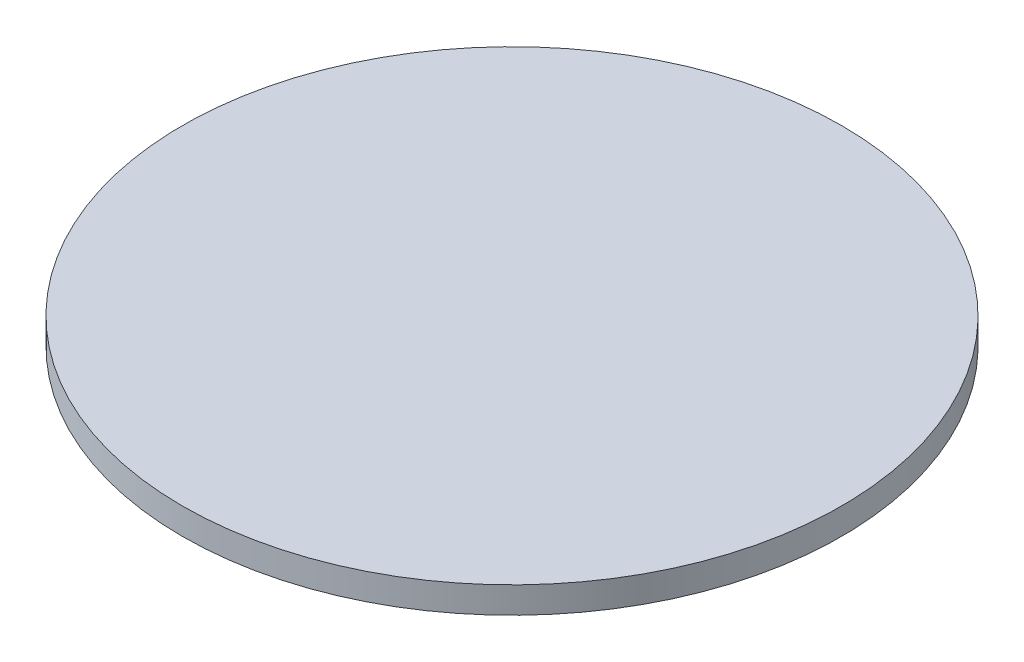
ISO-10303-21;
HEADER;
FILE_DESCRIPTION(('STEP AP214'),'2;1');
FILE_NAME('part.step','',(''),(''),'','','');
FILE_SCHEMA(('AUTOMOTIVE_DESIGN { 1 0 10303 214 1 1 1 1 }'));
ENDSEC;
DATA;
#1=APPLICATION_CONTEXT('core data for automotive mechanical design processes');
#2=APPLICATION_PROTOCOL_DEFINITION('international standard','automotive_design',2000,#1);
#3=PRODUCT_CONTEXT('',#1,'mechanical');
#4=PRODUCT('Part','Part','',(#3));
#5=PRODUCT_RELATED_PRODUCT_CATEGORY('part','',(#4));
#6=PRODUCT_DEFINITION_FORMATION('','',#4);
#7=PRODUCT_DEFINITION_CONTEXT('part definition',#1,'design');
#8=PRODUCT_DEFINITION('design','',#6,#7);
#9=PRODUCT_DEFINITION_SHAPE('','',#8);
#10=(LENGTH_UNIT() NAMED_UNIT(*) SI_UNIT(.MILLI.,.METRE.));
#11=(NAMED_UNIT(*) PLANE_ANGLE_UNIT() SI_UNIT($,.RADIAN.));
#12=(NAMED_UNIT(*) SI_UNIT($,.STERADIAN.) SOLID_ANGLE_UNIT());
#13=UNCERTAINTY_MEASURE_WITH_UNIT(LENGTH_MEASURE(1.E-05),#10,'distance_accuracy_value','');
#14=(GEOMETRIC_REPRESENTATION_CONTEXT(3) GLOBAL_UNCERTAINTY_ASSIGNED_CONTEXT((#13)) GLOBAL_UNIT_ASSIGNED_CONTEXT((#10,
#11,#12)) REPRESENTATION_CONTEXT('',''));
#15=CARTESIAN_POINT('',(0.,0.,0.));
#16=DIRECTION('',(0.,0.,1.));
#17=DIRECTION('',(1.,0.,0.));
#18=AXIS2_PLACEMENT_3D('',#15,#16,#17);
#19=CARTESIAN_POINT('',(0.,1.,0.));
#20=DIRECTION('',(0.,-1.,0.));
#21=DIRECTION('',(0.,0.,-1.));
#22=AXIS2_PLACEMENT_3D('',#19,#20,#21);
#23=CYLINDRICAL_SURFACE('',#22,12.5);
#24=CARTESIAN_POINT('',(0.,1.,0.));
#25=DIRECTION('',(0.,1.,0.));
#26=DIRECTION('',(0.,0.,1.));
#27=AXIS2_PLACEMENT_3D('',#24,#25,#26);
#28=CIRCLE('',#27,12.5);
#29=CARTESIAN_POINT('',(0.,1.,12.5));
#30=VERTEX_POINT('',#29);
#31=EDGE_CURVE('E10',#30,#30,#28,.T.);
#32=ORIENTED_EDGE('',*,*,#31,.F.);
#33=EDGE_LOOP('',(#32));
#34=FACE_BOUND('',#33,.T.);
#35=CARTESIAN_POINT('',(0.,0.,0.));
#36=DIRECTION('',(0.,1.,0.));
#37=DIRECTION('',(0.,0.,1.));
#38=AXIS2_PLACEMENT_3D('',#35,#36,#37);
#39=CIRCLE('',#38,12.5);
#40=CARTESIAN_POINT('',(0.,0.,12.5));
#41=VERTEX_POINT('',#40);
#42=EDGE_CURVE('E35',#41,#41,#39,.T.);
#43=ORIENTED_EDGE('',*,*,#42,.T.);
#44=EDGE_LOOP('',(#43));
#45=FACE_BOUND('',#44,.T.);
#46=ADVANCED_FACE('F32',(#34,#45),#23,.T.);
#47=CARTESIAN_POINT('',(0.,1.,0.));
#48=DIRECTION('',(0.,1.,0.));
#49=DIRECTION('',(0.,0.,1.));
#50=AXIS2_PLACEMENT_3D('',#47,#48,#49);
#51=PLANE('',#50);
#52=ORIENTED_EDGE('',*,*,#31,.T.);
#53=EDGE_LOOP('',(#52));
#54=FACE_BOUND('',#53,.T.);
#55=ADVANCED_FACE('F47',(#54),#51,.T.);
#56=CARTESIAN_POINT('',(0.,0.,0.));
#57=DIRECTION('',(0.,1.,0.));
#58=DIRECTION('',(0.,0.,1.));
#59=AXIS2_PLACEMENT_3D('',#56,#57,#58);
#60=PLANE('',#59);
#61=ORIENTED_EDGE('',*,*,#42,.F.);
#62=EDGE_LOOP('',(#61));
#63=FACE_BOUND('',#62,.T.);
#64=ADVANCED_FACE('F45',(#63),#60,.F.);
#65=CLOSED_SHELL('',(#46,#55,#64));
#66=MANIFOLD_SOLID_BREP('B2',#65);
#67=ADVANCED_BREP_SHAPE_REPRESENTATION('',(#18,#66),#14);
#68=SHAPE_DEFINITION_REPRESENTATION(#9,#67);
ENDSEC;
END-ISO-10303-21;
